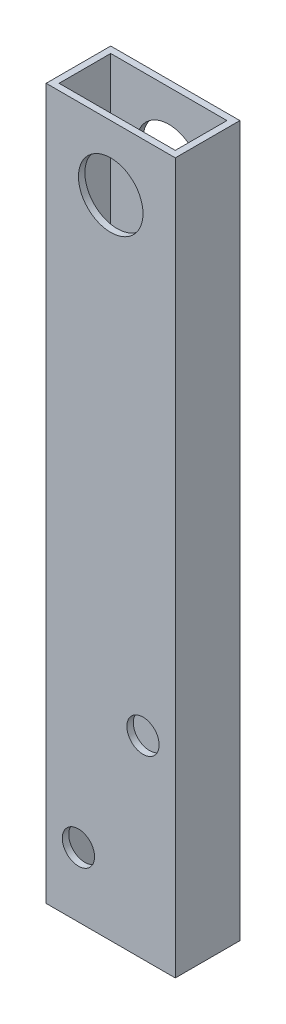
ISO-10303-21;
HEADER;
FILE_DESCRIPTION(('STEP AP214'),'2;1');
FILE_NAME('part.step','',(''),(''),'','','');
FILE_SCHEMA(('AUTOMOTIVE_DESIGN { 1 0 10303 214 1 1 1 1 }'));
ENDSEC;
DATA;
#1=APPLICATION_CONTEXT('core data for automotive mechanical design processes');
#2=APPLICATION_PROTOCOL_DEFINITION('international standard','automotive_design',2000,#1);
#3=PRODUCT_CONTEXT('',#1,'mechanical');
#4=PRODUCT('Part','Part','',(#3));
#5=PRODUCT_RELATED_PRODUCT_CATEGORY('part','',(#4));
#6=PRODUCT_DEFINITION_FORMATION('','',#4);
#7=PRODUCT_DEFINITION_CONTEXT('part definition',#1,'design');
#8=PRODUCT_DEFINITION('design','',#6,#7);
#9=PRODUCT_DEFINITION_SHAPE('','',#8);
#10=(LENGTH_UNIT() NAMED_UNIT(*) SI_UNIT(.MILLI.,.METRE.));
#11=(NAMED_UNIT(*) PLANE_ANGLE_UNIT() SI_UNIT($,.RADIAN.));
#12=(NAMED_UNIT(*) SI_UNIT($,.STERADIAN.) SOLID_ANGLE_UNIT());
#13=UNCERTAINTY_MEASURE_WITH_UNIT(LENGTH_MEASURE(1.E-05),#10,'distance_accuracy_value','');
#14=(GEOMETRIC_REPRESENTATION_CONTEXT(3) GLOBAL_UNCERTAINTY_ASSIGNED_CONTEXT((#13)) GLOBAL_UNIT_ASSIGNED_CONTEXT((#10,
#11,#12)) REPRESENTATION_CONTEXT('',''));
#15=CARTESIAN_POINT('',(0.,0.,0.));
#16=DIRECTION('',(0.,0.,1.));
#17=DIRECTION('',(1.,0.,0.));
#18=AXIS2_PLACEMENT_3D('',#15,#16,#17);
#19=CARTESIAN_POINT('',(0.,279.4,0.));
#20=DIRECTION('',(0.,-1.,0.));
#21=DIRECTION('',(0.,0.,-1.));
#22=AXIS2_PLACEMENT_3D('',#19,#20,#21);
#23=PLANE('',#22);
#24=DIRECTION('',(0.,0.,1.));
#25=VECTOR('',#24,1.);
#26=CARTESIAN_POINT('',(0.,279.4,0.));
#27=LINE('',#26,#25);
#28=CARTESIAN_POINT('',(0.,279.4,-25.4));
#29=VERTEX_POINT('',#28);
#30=CARTESIAN_POINT('',(0.,279.4,0.));
#31=VERTEX_POINT('',#30);
#32=EDGE_CURVE('E138',#29,#31,#27,.T.);
#33=ORIENTED_EDGE('',*,*,#32,.T.);
#34=DIRECTION('',(1.,0.,0.));
#35=VECTOR('',#34,1.);
#36=CARTESIAN_POINT('',(0.,279.4,0.));
#37=LINE('',#36,#35);
#38=CARTESIAN_POINT('',(50.8,279.4,0.));
#39=VERTEX_POINT('',#38);
#40=EDGE_CURVE('E141',#31,#39,#37,.T.);
#41=ORIENTED_EDGE('',*,*,#40,.T.);
#42=DIRECTION('',(0.,0.,-1.));
#43=VECTOR('',#42,1.);
#44=CARTESIAN_POINT('',(50.8,279.4,0.));
#45=LINE('',#44,#43);
#46=CARTESIAN_POINT('',(50.8,279.4,-25.4));
#47=VERTEX_POINT('',#46);
#48=EDGE_CURVE('E144',#39,#47,#45,.T.);
#49=ORIENTED_EDGE('',*,*,#48,.T.);
#50=DIRECTION('',(-1.,0.,0.));
#51=VECTOR('',#50,1.);
#52=CARTESIAN_POINT('',(0.,279.4,-25.4));
#53=LINE('',#52,#51);
#54=EDGE_CURVE('E146',#47,#29,#53,.T.);
#55=ORIENTED_EDGE('',*,*,#54,.T.);
#56=EDGE_LOOP('',(#33,#41,#49,#55));
#57=FACE_BOUND('',#56,.T.);
#58=DIRECTION('',(0.,0.,1.));
#59=VECTOR('',#58,1.);
#60=CARTESIAN_POINT('',(2.54,279.4,-2.54));
#61=LINE('',#60,#59);
#62=CARTESIAN_POINT('',(2.54,279.4,-22.86));
#63=VERTEX_POINT('',#62);
#64=CARTESIAN_POINT('',(2.54,279.4,-2.54));
#65=VERTEX_POINT('',#64);
#66=EDGE_CURVE('E100',#63,#65,#61,.T.);
#67=ORIENTED_EDGE('',*,*,#66,.F.);
#68=DIRECTION('',(-1.,0.,0.));
#69=VECTOR('',#68,1.);
#70=CARTESIAN_POINT('',(2.54,279.4,-22.86));
#71=LINE('',#70,#69);
#72=CARTESIAN_POINT('',(48.26,279.4,-22.86));
#73=VERTEX_POINT('',#72);
#74=EDGE_CURVE('E122',#73,#63,#71,.T.);
#75=ORIENTED_EDGE('',*,*,#74,.F.);
#76=DIRECTION('',(0.,0.,-1.));
#77=VECTOR('',#76,1.);
#78=CARTESIAN_POINT('',(48.26,279.4,-2.54));
#79=LINE('',#78,#77);
#80=CARTESIAN_POINT('',(48.26,279.4,-2.54));
#81=VERTEX_POINT('',#80);
#82=EDGE_CURVE('E120',#81,#73,#79,.T.);
#83=ORIENTED_EDGE('',*,*,#82,.F.);
#84=DIRECTION('',(1.,0.,0.));
#85=VECTOR('',#84,1.);
#86=CARTESIAN_POINT('',(2.54,279.4,-2.54));
#87=LINE('',#86,#85);
#88=EDGE_CURVE('E108',#65,#81,#87,.T.);
#89=ORIENTED_EDGE('',*,*,#88,.F.);
#90=EDGE_LOOP('',(#67,#75,#83,#89));
#91=FACE_BOUND('',#90,.T.);
#92=ADVANCED_FACE('F33',(#57,#91),#23,.F.);
#93=CARTESIAN_POINT('',(0.,0.,0.));
#94=DIRECTION('',(0.,-1.,0.));
#95=DIRECTION('',(0.,0.,-1.));
#96=AXIS2_PLACEMENT_3D('',#93,#94,#95);
#97=PLANE('',#96);
#98=DIRECTION('',(0.,0.,1.));
#99=VECTOR('',#98,1.);
#100=CARTESIAN_POINT('',(0.,0.,0.));
#101=LINE('',#100,#99);
#102=CARTESIAN_POINT('',(0.,0.,-25.4));
#103=VERTEX_POINT('',#102);
#104=CARTESIAN_POINT('',(0.,0.,0.));
#105=VERTEX_POINT('',#104);
#106=EDGE_CURVE('E116',#103,#105,#101,.T.);
#107=ORIENTED_EDGE('',*,*,#106,.F.);
#108=DIRECTION('',(-1.,0.,0.));
#109=VECTOR('',#108,1.);
#110=CARTESIAN_POINT('',(0.,0.,-25.4));
#111=LINE('',#110,#109);
#112=CARTESIAN_POINT('',(50.8,0.,-25.4));
#113=VERTEX_POINT('',#112);
#114=EDGE_CURVE('E142',#113,#103,#111,.T.);
#115=ORIENTED_EDGE('',*,*,#114,.F.);
#116=DIRECTION('',(0.,0.,-1.));
#117=VECTOR('',#116,1.);
#118=CARTESIAN_POINT('',(50.8,0.,0.));
#119=LINE('',#118,#117);
#120=CARTESIAN_POINT('',(50.8,0.,0.));
#121=VERTEX_POINT('',#120);
#122=EDGE_CURVE('E153',#121,#113,#119,.T.);
#123=ORIENTED_EDGE('',*,*,#122,.F.);
#124=DIRECTION('',(1.,0.,0.));
#125=VECTOR('',#124,1.);
#126=CARTESIAN_POINT('',(0.,0.,0.));
#127=LINE('',#126,#125);
#128=EDGE_CURVE('E151',#105,#121,#127,.T.);
#129=ORIENTED_EDGE('',*,*,#128,.F.);
#130=EDGE_LOOP('',(#107,#115,#123,#129));
#131=FACE_BOUND('',#130,.T.);
#132=DIRECTION('',(-1.,0.,0.));
#133=VECTOR('',#132,1.);
#134=CARTESIAN_POINT('',(2.54,0.,-22.86));
#135=LINE('',#134,#133);
#136=CARTESIAN_POINT('',(48.26,0.,-22.86));
#137=VERTEX_POINT('',#136);
#138=CARTESIAN_POINT('',(2.54,0.,-22.86));
#139=VERTEX_POINT('',#138);
#140=EDGE_CURVE('E109',#137,#139,#135,.T.);
#141=ORIENTED_EDGE('',*,*,#140,.T.);
#142=DIRECTION('',(0.,0.,1.));
#143=VECTOR('',#142,1.);
#144=CARTESIAN_POINT('',(2.54,0.,-2.54));
#145=LINE('',#144,#143);
#146=CARTESIAN_POINT('',(2.54,0.,-2.54));
#147=VERTEX_POINT('',#146);
#148=EDGE_CURVE('E58',#139,#147,#145,.T.);
#149=ORIENTED_EDGE('',*,*,#148,.T.);
#150=DIRECTION('',(1.,0.,0.));
#151=VECTOR('',#150,1.);
#152=CARTESIAN_POINT('',(2.54,0.,-2.54));
#153=LINE('',#152,#151);
#154=CARTESIAN_POINT('',(48.26,0.,-2.54));
#155=VERTEX_POINT('',#154);
#156=EDGE_CURVE('E115',#147,#155,#153,.T.);
#157=ORIENTED_EDGE('',*,*,#156,.T.);
#158=DIRECTION('',(0.,0.,-1.));
#159=VECTOR('',#158,1.);
#160=CARTESIAN_POINT('',(48.26,0.,-2.54));
#161=LINE('',#160,#159);
#162=EDGE_CURVE('E130',#155,#137,#161,.T.);
#163=ORIENTED_EDGE('',*,*,#162,.T.);
#164=EDGE_LOOP('',(#141,#149,#157,#163));
#165=FACE_BOUND('',#164,.T.);
#166=ADVANCED_FACE('F211',(#131,#165),#97,.T.);
#167=CARTESIAN_POINT('',(0.,279.4,0.));
#168=DIRECTION('',(1.,0.,0.));
#169=DIRECTION('',(0.,0.,-1.));
#170=AXIS2_PLACEMENT_3D('',#167,#168,#169);
#171=PLANE('',#170);
#172=ORIENTED_EDGE('',*,*,#106,.T.);
#173=DIRECTION('',(0.,-1.,0.));
#174=VECTOR('',#173,1.);
#175=CARTESIAN_POINT('',(0.,279.4,0.));
#176=LINE('',#175,#174);
#177=EDGE_CURVE('E11',#31,#105,#176,.T.);
#178=ORIENTED_EDGE('',*,*,#177,.F.);
#179=ORIENTED_EDGE('',*,*,#32,.F.);
#180=DIRECTION('',(0.,-1.,0.));
#181=VECTOR('',#180,1.);
#182=CARTESIAN_POINT('',(0.,279.4,-25.4));
#183=LINE('',#182,#181);
#184=EDGE_CURVE('E148',#29,#103,#183,.T.);
#185=ORIENTED_EDGE('',*,*,#184,.T.);
#186=EDGE_LOOP('',(#172,#178,#179,#185));
#187=FACE_BOUND('',#186,.T.);
#188=ADVANCED_FACE('F35',(#187),#171,.F.);
#189=CARTESIAN_POINT('',(0.,279.4,0.));
#190=DIRECTION('',(0.,0.,-1.));
#191=DIRECTION('',(-1.,0.,0.));
#192=AXIS2_PLACEMENT_3D('',#189,#190,#191);
#193=PLANE('',#192);
#194=CARTESIAN_POINT('',(38.1,76.2,0.));
#195=DIRECTION('',(0.,0.,-1.));
#196=DIRECTION('',(-1.,0.,0.));
#197=AXIS2_PLACEMENT_3D('',#194,#195,#196);
#198=CIRCLE('',#197,6.35);
#199=CARTESIAN_POINT('',(31.75,76.2,0.));
#200=VERTEX_POINT('',#199);
#201=EDGE_CURVE('E236',#200,#200,#198,.T.);
#202=ORIENTED_EDGE('',*,*,#201,.T.);
#203=EDGE_LOOP('',(#202));
#204=FACE_BOUND('',#203,.T.);
#205=CARTESIAN_POINT('',(25.4000000000001,254.,0.));
#206=DIRECTION('',(0.,0.,1.));
#207=DIRECTION('',(1.,0.,0.));
#208=AXIS2_PLACEMENT_3D('',#205,#206,#207);
#209=CIRCLE('',#208,12.7);
#210=CARTESIAN_POINT('',(38.1000000000001,254.,0.));
#211=VERTEX_POINT('',#210);
#212=EDGE_CURVE('E176',#211,#211,#209,.T.);
#213=ORIENTED_EDGE('',*,*,#212,.F.);
#214=EDGE_LOOP('',(#213));
#215=FACE_BOUND('',#214,.T.);
#216=CARTESIAN_POINT('',(12.7,25.4,0.));
#217=DIRECTION('',(0.,0.,1.));
#218=DIRECTION('',(1.,0.,0.));
#219=AXIS2_PLACEMENT_3D('',#216,#217,#218);
#220=CIRCLE('',#219,6.35);
#221=CARTESIAN_POINT('',(19.05,25.4,0.));
#222=VERTEX_POINT('',#221);
#223=EDGE_CURVE('E173',#222,#222,#220,.T.);
#224=ORIENTED_EDGE('',*,*,#223,.F.);
#225=EDGE_LOOP('',(#224));
#226=FACE_BOUND('',#225,.T.);
#227=ORIENTED_EDGE('',*,*,#128,.T.);
#228=DIRECTION('',(0.,-1.,0.));
#229=VECTOR('',#228,1.);
#230=CARTESIAN_POINT('',(50.8,279.4,0.));
#231=LINE('',#230,#229);
#232=EDGE_CURVE('E42',#39,#121,#231,.T.);
#233=ORIENTED_EDGE('',*,*,#232,.F.);
#234=ORIENTED_EDGE('',*,*,#40,.F.);
#235=ORIENTED_EDGE('',*,*,#177,.T.);
#236=EDGE_LOOP('',(#227,#233,#234,#235));
#237=FACE_BOUND('',#236,.T.);
#238=ADVANCED_FACE('F225',(#204,#215,#226,#237),#193,.F.);
#239=CARTESIAN_POINT('',(50.8,279.4,0.));
#240=DIRECTION('',(-1.,0.,0.));
#241=DIRECTION('',(0.,0.,1.));
#242=AXIS2_PLACEMENT_3D('',#239,#240,#241);
#243=PLANE('',#242);
#244=ORIENTED_EDGE('',*,*,#122,.T.);
#245=DIRECTION('',(0.,-1.,0.));
#246=VECTOR('',#245,1.);
#247=CARTESIAN_POINT('',(50.8,279.4,-25.4));
#248=LINE('',#247,#246);
#249=EDGE_CURVE('E158',#47,#113,#248,.T.);
#250=ORIENTED_EDGE('',*,*,#249,.F.);
#251=ORIENTED_EDGE('',*,*,#48,.F.);
#252=ORIENTED_EDGE('',*,*,#232,.T.);
#253=EDGE_LOOP('',(#244,#250,#251,#252));
#254=FACE_BOUND('',#253,.T.);
#255=ADVANCED_FACE('F222',(#254),#243,.F.);
#256=CARTESIAN_POINT('',(0.,279.4,-25.4));
#257=DIRECTION('',(0.,0.,1.));
#258=DIRECTION('',(1.,0.,0.));
#259=AXIS2_PLACEMENT_3D('',#256,#257,#258);
#260=PLANE('',#259);
#261=CARTESIAN_POINT('',(38.1,76.2,-25.4));
#262=DIRECTION('',(0.,0.,-1.));
#263=DIRECTION('',(-1.,0.,0.));
#264=AXIS2_PLACEMENT_3D('',#261,#262,#263);
#265=CIRCLE('',#264,6.35);
#266=CARTESIAN_POINT('',(31.75,76.2,-25.4));
#267=VERTEX_POINT('',#266);
#268=EDGE_CURVE('E284',#267,#267,#265,.T.);
#269=ORIENTED_EDGE('',*,*,#268,.F.);
#270=EDGE_LOOP('',(#269));
#271=FACE_BOUND('',#270,.T.);
#272=CARTESIAN_POINT('',(25.4000000000001,254.,-25.4));
#273=DIRECTION('',(0.,0.,1.));
#274=DIRECTION('',(1.,0.,0.));
#275=AXIS2_PLACEMENT_3D('',#272,#273,#274);
#276=CIRCLE('',#275,12.7);
#277=CARTESIAN_POINT('',(38.1000000000001,254.,-25.4));
#278=VERTEX_POINT('',#277);
#279=EDGE_CURVE('E169',#278,#278,#276,.T.);
#280=ORIENTED_EDGE('',*,*,#279,.T.);
#281=EDGE_LOOP('',(#280));
#282=FACE_BOUND('',#281,.T.);
#283=CARTESIAN_POINT('',(12.7,25.4,-25.4));
#284=DIRECTION('',(0.,0.,1.));
#285=DIRECTION('',(1.,0.,0.));
#286=AXIS2_PLACEMENT_3D('',#283,#284,#285);
#287=CIRCLE('',#286,6.35);
#288=CARTESIAN_POINT('',(19.05,25.4,-25.4));
#289=VERTEX_POINT('',#288);
#290=EDGE_CURVE('E165',#289,#289,#287,.T.);
#291=ORIENTED_EDGE('',*,*,#290,.T.);
#292=EDGE_LOOP('',(#291));
#293=FACE_BOUND('',#292,.T.);
#294=ORIENTED_EDGE('',*,*,#114,.T.);
#295=ORIENTED_EDGE('',*,*,#184,.F.);
#296=ORIENTED_EDGE('',*,*,#54,.F.);
#297=ORIENTED_EDGE('',*,*,#249,.T.);
#298=EDGE_LOOP('',(#294,#295,#296,#297));
#299=FACE_BOUND('',#298,.T.);
#300=ADVANCED_FACE('F206',(#271,#282,#293,#299),#260,.F.);
#301=CARTESIAN_POINT('',(2.54,279.4,-2.54));
#302=DIRECTION('',(1.,0.,0.));
#303=DIRECTION('',(0.,0.,-1.));
#304=AXIS2_PLACEMENT_3D('',#301,#302,#303);
#305=PLANE('',#304);
#306=ORIENTED_EDGE('',*,*,#148,.F.);
#307=DIRECTION('',(0.,-1.,0.));
#308=VECTOR('',#307,1.);
#309=CARTESIAN_POINT('',(2.54,279.4,-22.86));
#310=LINE('',#309,#308);
#311=EDGE_CURVE('E104',#63,#139,#310,.T.);
#312=ORIENTED_EDGE('',*,*,#311,.F.);
#313=ORIENTED_EDGE('',*,*,#66,.T.);
#314=DIRECTION('',(0.,-1.,0.));
#315=VECTOR('',#314,1.);
#316=CARTESIAN_POINT('',(2.54,279.4,-2.54));
#317=LINE('',#316,#315);
#318=EDGE_CURVE('E103',#65,#147,#317,.T.);
#319=ORIENTED_EDGE('',*,*,#318,.T.);
#320=EDGE_LOOP('',(#306,#312,#313,#319));
#321=FACE_BOUND('',#320,.T.);
#322=ADVANCED_FACE('F102',(#321),#305,.T.);
#323=CARTESIAN_POINT('',(2.54,279.4,-2.54));
#324=DIRECTION('',(0.,0.,-1.));
#325=DIRECTION('',(-1.,0.,0.));
#326=AXIS2_PLACEMENT_3D('',#323,#324,#325);
#327=PLANE('',#326);
#328=CARTESIAN_POINT('',(38.1,76.2,-2.54));
#329=DIRECTION('',(0.,0.,-1.));
#330=DIRECTION('',(-1.,0.,0.));
#331=AXIS2_PLACEMENT_3D('',#328,#329,#330);
#332=CIRCLE('',#331,6.35);
#333=CARTESIAN_POINT('',(31.75,76.2,-2.54));
#334=VERTEX_POINT('',#333);
#335=EDGE_CURVE('E181',#334,#334,#332,.T.);
#336=ORIENTED_EDGE('',*,*,#335,.F.);
#337=EDGE_LOOP('',(#336));
#338=FACE_BOUND('',#337,.T.);
#339=CARTESIAN_POINT('',(25.4000000000001,254.,-2.54));
#340=DIRECTION('',(0.,0.,-1.));
#341=DIRECTION('',(-1.,0.,0.));
#342=AXIS2_PLACEMENT_3D('',#339,#340,#341);
#343=CIRCLE('',#342,12.7);
#344=CARTESIAN_POINT('',(12.7000000000001,254.,-2.54));
#345=VERTEX_POINT('',#344);
#346=EDGE_CURVE('E168',#345,#345,#343,.T.);
#347=ORIENTED_EDGE('',*,*,#346,.F.);
#348=EDGE_LOOP('',(#347));
#349=FACE_BOUND('',#348,.T.);
#350=CARTESIAN_POINT('',(12.7,25.4,-2.54));
#351=DIRECTION('',(0.,0.,-1.));
#352=DIRECTION('',(-1.,0.,0.));
#353=AXIS2_PLACEMENT_3D('',#350,#351,#352);
#354=CIRCLE('',#353,6.35);
#355=CARTESIAN_POINT('',(6.34999999999999,25.4,-2.54));
#356=VERTEX_POINT('',#355);
#357=EDGE_CURVE('E128',#356,#356,#354,.T.);
#358=ORIENTED_EDGE('',*,*,#357,.F.);
#359=EDGE_LOOP('',(#358));
#360=FACE_BOUND('',#359,.T.);
#361=ORIENTED_EDGE('',*,*,#156,.F.);
#362=ORIENTED_EDGE('',*,*,#318,.F.);
#363=ORIENTED_EDGE('',*,*,#88,.T.);
#364=DIRECTION('',(0.,-1.,0.));
#365=VECTOR('',#364,1.);
#366=CARTESIAN_POINT('',(48.26,279.4,-2.54));
#367=LINE('',#366,#365);
#368=EDGE_CURVE('E117',#81,#155,#367,.T.);
#369=ORIENTED_EDGE('',*,*,#368,.T.);
#370=EDGE_LOOP('',(#361,#362,#363,#369));
#371=FACE_BOUND('',#370,.T.);
#372=ADVANCED_FACE('F112',(#338,#349,#360,#371),#327,.T.);
#373=CARTESIAN_POINT('',(48.26,279.4,-2.54));
#374=DIRECTION('',(-1.,0.,0.));
#375=DIRECTION('',(0.,0.,1.));
#376=AXIS2_PLACEMENT_3D('',#373,#374,#375);
#377=PLANE('',#376);
#378=ORIENTED_EDGE('',*,*,#162,.F.);
#379=ORIENTED_EDGE('',*,*,#368,.F.);
#380=ORIENTED_EDGE('',*,*,#82,.T.);
#381=DIRECTION('',(0.,-1.,0.));
#382=VECTOR('',#381,1.);
#383=CARTESIAN_POINT('',(48.26,279.4,-22.86));
#384=LINE('',#383,#382);
#385=EDGE_CURVE('E50',#73,#137,#384,.T.);
#386=ORIENTED_EDGE('',*,*,#385,.T.);
#387=EDGE_LOOP('',(#378,#379,#380,#386));
#388=FACE_BOUND('',#387,.T.);
#389=ADVANCED_FACE('F196',(#388),#377,.T.);
#390=CARTESIAN_POINT('',(2.54,279.4,-22.86));
#391=DIRECTION('',(0.,0.,1.));
#392=DIRECTION('',(1.,0.,0.));
#393=AXIS2_PLACEMENT_3D('',#390,#391,#392);
#394=PLANE('',#393);
#395=CARTESIAN_POINT('',(38.1,76.2,-22.86));
#396=DIRECTION('',(0.,0.,1.));
#397=DIRECTION('',(1.,0.,0.));
#398=AXIS2_PLACEMENT_3D('',#395,#396,#397);
#399=CIRCLE('',#398,6.35);
#400=CARTESIAN_POINT('',(44.45,76.2,-22.86));
#401=VERTEX_POINT('',#400);
#402=EDGE_CURVE('E37',#401,#401,#399,.T.);
#403=ORIENTED_EDGE('',*,*,#402,.F.);
#404=EDGE_LOOP('',(#403));
#405=FACE_BOUND('',#404,.T.);
#406=CARTESIAN_POINT('',(25.4000000000001,254.,-22.86));
#407=DIRECTION('',(0.,0.,1.));
#408=DIRECTION('',(1.,0.,0.));
#409=AXIS2_PLACEMENT_3D('',#406,#407,#408);
#410=CIRCLE('',#409,12.7);
#411=CARTESIAN_POINT('',(38.1000000000001,254.,-22.86));
#412=VERTEX_POINT('',#411);
#413=EDGE_CURVE('E166',#412,#412,#410,.T.);
#414=ORIENTED_EDGE('',*,*,#413,.F.);
#415=EDGE_LOOP('',(#414));
#416=FACE_BOUND('',#415,.T.);
#417=CARTESIAN_POINT('',(12.7,25.4,-22.86));
#418=DIRECTION('',(0.,0.,1.));
#419=DIRECTION('',(1.,0.,0.));
#420=AXIS2_PLACEMENT_3D('',#417,#418,#419);
#421=CIRCLE('',#420,6.35);
#422=CARTESIAN_POINT('',(19.05,25.4,-22.86));
#423=VERTEX_POINT('',#422);
#424=EDGE_CURVE('E163',#423,#423,#421,.T.);
#425=ORIENTED_EDGE('',*,*,#424,.F.);
#426=EDGE_LOOP('',(#425));
#427=FACE_BOUND('',#426,.T.);
#428=ORIENTED_EDGE('',*,*,#140,.F.);
#429=ORIENTED_EDGE('',*,*,#385,.F.);
#430=ORIENTED_EDGE('',*,*,#74,.T.);
#431=ORIENTED_EDGE('',*,*,#311,.T.);
#432=EDGE_LOOP('',(#428,#429,#430,#431));
#433=FACE_BOUND('',#432,.T.);
#434=ADVANCED_FACE('F203',(#405,#416,#427,#433),#394,.T.);
#435=CARTESIAN_POINT('',(12.7,25.4,-25.4));
#436=DIRECTION('',(0.,0.,1.));
#437=DIRECTION('',(1.,0.,0.));
#438=AXIS2_PLACEMENT_3D('',#435,#436,#437);
#439=CYLINDRICAL_SURFACE('',#438,6.35);
#440=ORIENTED_EDGE('',*,*,#424,.T.);
#441=EDGE_LOOP('',(#440));
#442=FACE_BOUND('',#441,.T.);
#443=ORIENTED_EDGE('',*,*,#290,.F.);
#444=EDGE_LOOP('',(#443));
#445=FACE_BOUND('',#444,.T.);
#446=ADVANCED_FACE('F255',(#442,#445),#439,.F.);
#447=ORIENTED_EDGE('',*,*,#357,.T.);
#448=EDGE_LOOP('',(#447));
#449=FACE_BOUND('',#448,.T.);
#450=ORIENTED_EDGE('',*,*,#223,.T.);
#451=EDGE_LOOP('',(#450));
#452=FACE_BOUND('',#451,.T.);
#453=ADVANCED_FACE('F192',(#449,#452),#439,.F.);
#454=CARTESIAN_POINT('',(25.4000000000001,254.,-25.4));
#455=DIRECTION('',(0.,0.,1.));
#456=DIRECTION('',(1.,0.,0.));
#457=AXIS2_PLACEMENT_3D('',#454,#455,#456);
#458=CYLINDRICAL_SURFACE('',#457,12.7);
#459=ORIENTED_EDGE('',*,*,#413,.T.);
#460=EDGE_LOOP('',(#459));
#461=FACE_BOUND('',#460,.T.);
#462=ORIENTED_EDGE('',*,*,#279,.F.);
#463=EDGE_LOOP('',(#462));
#464=FACE_BOUND('',#463,.T.);
#465=ADVANCED_FACE('F266',(#461,#464),#458,.F.);
#466=ORIENTED_EDGE('',*,*,#346,.T.);
#467=EDGE_LOOP('',(#466));
#468=FACE_BOUND('',#467,.T.);
#469=ORIENTED_EDGE('',*,*,#212,.T.);
#470=EDGE_LOOP('',(#469));
#471=FACE_BOUND('',#470,.T.);
#472=ADVANCED_FACE('F269',(#468,#471),#458,.F.);
#473=CARTESIAN_POINT('',(38.1,76.2,0.));
#474=DIRECTION('',(0.,0.,-1.));
#475=DIRECTION('',(-1.,0.,0.));
#476=AXIS2_PLACEMENT_3D('',#473,#474,#475);
#477=CYLINDRICAL_SURFACE('',#476,6.35);
#478=ORIENTED_EDGE('',*,*,#402,.T.);
#479=EDGE_LOOP('',(#478));
#480=FACE_BOUND('',#479,.T.);
#481=ORIENTED_EDGE('',*,*,#268,.T.);
#482=EDGE_LOOP('',(#481));
#483=FACE_BOUND('',#482,.T.);
#484=ADVANCED_FACE('F270',(#480,#483),#477,.F.);
#485=ORIENTED_EDGE('',*,*,#335,.T.);
#486=EDGE_LOOP('',(#485));
#487=FACE_BOUND('',#486,.T.);
#488=ORIENTED_EDGE('',*,*,#201,.F.);
#489=EDGE_LOOP('',(#488));
#490=FACE_BOUND('',#489,.T.);
#491=ADVANCED_FACE('F272',(#487,#490),#477,.F.);
#492=CLOSED_SHELL('',(#92,#166,#188,#238,#255,#300,#322,#372,#389,#434,#446,#453,#465,#472,#484,#491));
#493=MANIFOLD_SOLID_BREP('B2',#492);
#494=ADVANCED_BREP_SHAPE_REPRESENTATION('',(#18,#493),#14);
#495=SHAPE_DEFINITION_REPRESENTATION(#9,#494);
ENDSEC;
END-ISO-10303-21;
